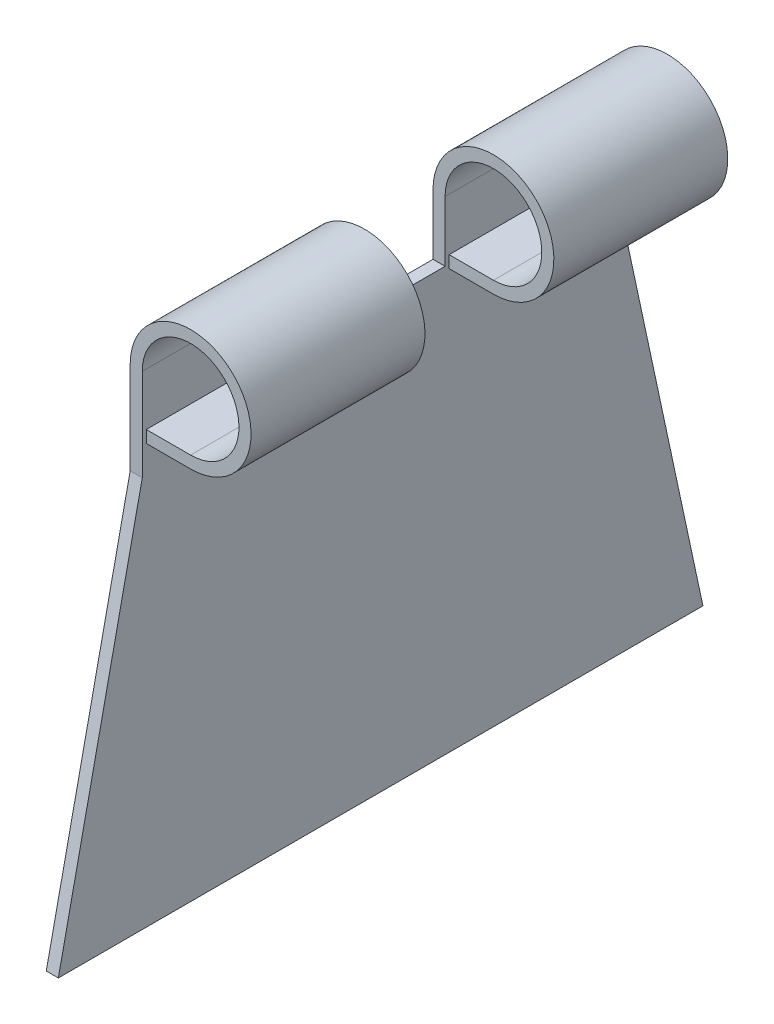
ISO-10303-21;
HEADER;
FILE_DESCRIPTION(('STEP AP214'),'2;1');
FILE_NAME('part.step','',(''),(''),'','','');
FILE_SCHEMA(('AUTOMOTIVE_DESIGN { 1 0 10303 214 1 1 1 1 }'));
ENDSEC;
DATA;
#1=APPLICATION_CONTEXT('core data for automotive mechanical design processes');
#2=APPLICATION_PROTOCOL_DEFINITION('international standard','automotive_design',2000,#1);
#3=PRODUCT_CONTEXT('',#1,'mechanical');
#4=PRODUCT('Part','Part','',(#3));
#5=PRODUCT_RELATED_PRODUCT_CATEGORY('part','',(#4));
#6=PRODUCT_DEFINITION_FORMATION('','',#4);
#7=PRODUCT_DEFINITION_CONTEXT('part definition',#1,'design');
#8=PRODUCT_DEFINITION('design','',#6,#7);
#9=PRODUCT_DEFINITION_SHAPE('','',#8);
#10=(LENGTH_UNIT() NAMED_UNIT(*) SI_UNIT(.MILLI.,.METRE.));
#11=(NAMED_UNIT(*) PLANE_ANGLE_UNIT() SI_UNIT($,.RADIAN.));
#12=(NAMED_UNIT(*) SI_UNIT($,.STERADIAN.) SOLID_ANGLE_UNIT());
#13=UNCERTAINTY_MEASURE_WITH_UNIT(LENGTH_MEASURE(1.E-05),#10,'distance_accuracy_value','');
#14=(GEOMETRIC_REPRESENTATION_CONTEXT(3) GLOBAL_UNCERTAINTY_ASSIGNED_CONTEXT((#13)) GLOBAL_UNIT_ASSIGNED_CONTEXT((#10,
#11,#12)) REPRESENTATION_CONTEXT('',''));
#15=CARTESIAN_POINT('',(0.,0.,0.));
#16=DIRECTION('',(0.,0.,1.));
#17=DIRECTION('',(1.,0.,0.));
#18=AXIS2_PLACEMENT_3D('',#15,#16,#17);
#19=CARTESIAN_POINT('',(0.,0.,80.));
#20=DIRECTION('',(0.,0.,-1.));
#21=DIRECTION('',(-1.,0.,0.));
#22=AXIS2_PLACEMENT_3D('',#19,#20,#21);
#23=CYLINDRICAL_SURFACE('',#22,7.5);
#24=CARTESIAN_POINT('',(0.,0.,10.4148336680274));
#25=DIRECTION('',(0.,0.,1.));
#26=DIRECTION('',(1.,0.,0.));
#27=AXIS2_PLACEMENT_3D('',#24,#25,#26);
#28=CIRCLE('',#27,7.5);
#29=CARTESIAN_POINT('',(0.,-7.5,10.4148336680274));
#30=VERTEX_POINT('',#29);
#31=CARTESIAN_POINT('',(-7.5,0.,10.4148336680274));
#32=VERTEX_POINT('',#31);
#33=EDGE_CURVE('E225',#30,#32,#28,.T.);
#34=ORIENTED_EDGE('',*,*,#33,.T.);
#35=DIRECTION('',(0.,0.,-1.));
#36=VECTOR('',#35,1.);
#37=CARTESIAN_POINT('',(-7.5,0.,80.));
#38=LINE('',#37,#36);
#39=CARTESIAN_POINT('',(-7.5,0.,32.));
#40=VERTEX_POINT('',#39);
#41=EDGE_CURVE('E288',#40,#32,#38,.T.);
#42=ORIENTED_EDGE('',*,*,#41,.F.);
#43=CARTESIAN_POINT('',(0.,0.,32.));
#44=DIRECTION('',(0.,0.,1.));
#45=DIRECTION('',(1.,0.,0.));
#46=AXIS2_PLACEMENT_3D('',#43,#44,#45);
#47=CIRCLE('',#46,7.5);
#48=CARTESIAN_POINT('',(0.,-7.5,32.));
#49=VERTEX_POINT('',#48);
#50=EDGE_CURVE('E261',#49,#40,#47,.T.);
#51=ORIENTED_EDGE('',*,*,#50,.F.);
#52=DIRECTION('',(0.,0.,-1.));
#53=VECTOR('',#52,1.);
#54=CARTESIAN_POINT('',(0.,-7.5,80.));
#55=LINE('',#54,#53);
#56=EDGE_CURVE('E268',#49,#30,#55,.T.);
#57=ORIENTED_EDGE('',*,*,#56,.T.);
#58=EDGE_LOOP('',(#34,#42,#51,#57));
#59=FACE_BOUND('',#58,.T.);
#60=ADVANCED_FACE('F43',(#59),#23,.T.);
#61=CARTESIAN_POINT('',(-7.5,0.,69.5851663319726));
#62=VERTEX_POINT('',#61);
#63=CARTESIAN_POINT('',(-7.5,0.,48.));
#64=VERTEX_POINT('',#63);
#65=EDGE_CURVE('E289',#62,#64,#38,.T.);
#66=ORIENTED_EDGE('',*,*,#65,.F.);
#67=CARTESIAN_POINT('',(0.,0.,69.5851663319726));
#68=DIRECTION('',(0.,0.,-1.));
#69=DIRECTION('',(-1.,0.,0.));
#70=AXIS2_PLACEMENT_3D('',#67,#68,#69);
#71=CIRCLE('',#70,7.5);
#72=CARTESIAN_POINT('',(0.,-7.5,69.5851663319726));
#73=VERTEX_POINT('',#72);
#74=EDGE_CURVE('E179',#62,#73,#71,.T.);
#75=ORIENTED_EDGE('',*,*,#74,.T.);
#76=CARTESIAN_POINT('',(0.,-7.5,48.));
#77=VERTEX_POINT('',#76);
#78=EDGE_CURVE('E57',#73,#77,#55,.T.);
#79=ORIENTED_EDGE('',*,*,#78,.T.);
#80=CARTESIAN_POINT('',(0.,0.,48.));
#81=DIRECTION('',(0.,0.,-1.));
#82=DIRECTION('',(-1.,0.,0.));
#83=AXIS2_PLACEMENT_3D('',#80,#81,#82);
#84=CIRCLE('',#83,7.5);
#85=EDGE_CURVE('E251',#64,#77,#84,.T.);
#86=ORIENTED_EDGE('',*,*,#85,.F.);
#87=EDGE_LOOP('',(#66,#75,#79,#86));
#88=FACE_BOUND('',#87,.T.);
#89=ADVANCED_FACE('F355',(#88),#23,.T.);
#90=CARTESIAN_POINT('',(-7.5,0.,80.));
#91=DIRECTION('',(1.,0.,0.));
#92=DIRECTION('',(0.,1.,0.));
#93=AXIS2_PLACEMENT_3D('',#90,#91,#92);
#94=PLANE('',#93);
#95=DIRECTION('',(0.,0.,-1.));
#96=VECTOR('',#95,1.);
#97=CARTESIAN_POINT('',(-7.49999999999999,-60.,80.));
#98=LINE('',#97,#96);
#99=CARTESIAN_POINT('',(-7.49999999999999,-60.,80.));
#100=VERTEX_POINT('',#99);
#101=CARTESIAN_POINT('',(-7.49999999999999,-60.,0.));
#102=VERTEX_POINT('',#101);
#103=EDGE_CURVE('E187',#100,#102,#98,.T.);
#104=ORIENTED_EDGE('',*,*,#103,.F.);
#105=DIRECTION('',(0.,-0.977763914611379,0.209708672409683));
#106=VECTOR('',#105,1.);
#107=CARTESIAN_POINT('',(-7.49999999999999,-60.,80.));
#108=LINE('',#107,#106);
#109=CARTESIAN_POINT('',(-7.5,-11.4409756150522,69.5851663319726));
#110=VERTEX_POINT('',#109);
#111=EDGE_CURVE('E66',#110,#100,#108,.T.);
#112=ORIENTED_EDGE('',*,*,#111,.F.);
#113=DIRECTION('',(0.,-1.,0.));
#114=VECTOR('',#113,1.);
#115=CARTESIAN_POINT('',(-7.5,-11.4409756150522,69.5851663319726));
#116=LINE('',#115,#114);
#117=EDGE_CURVE('E176',#62,#110,#116,.T.);
#118=ORIENTED_EDGE('',*,*,#117,.F.);
#119=ORIENTED_EDGE('',*,*,#65,.T.);
#120=DIRECTION('',(0.,-1.,0.));
#121=VECTOR('',#120,1.);
#122=CARTESIAN_POINT('',(-7.5,7.5,48.));
#123=LINE('',#122,#121);
#124=CARTESIAN_POINT('',(-7.5,-7.5,48.));
#125=VERTEX_POINT('',#124);
#126=EDGE_CURVE('E235',#64,#125,#123,.T.);
#127=ORIENTED_EDGE('',*,*,#126,.T.);
#128=DIRECTION('',(0.,0.,1.));
#129=VECTOR('',#128,1.);
#130=CARTESIAN_POINT('',(-7.5,-7.5,32.));
#131=LINE('',#130,#129);
#132=CARTESIAN_POINT('',(-7.5,-7.5,32.));
#133=VERTEX_POINT('',#132);
#134=EDGE_CURVE('E230',#133,#125,#131,.T.);
#135=ORIENTED_EDGE('',*,*,#134,.F.);
#136=DIRECTION('',(0.,-1.,0.));
#137=VECTOR('',#136,1.);
#138=CARTESIAN_POINT('',(-7.5,7.5,32.));
#139=LINE('',#138,#137);
#140=EDGE_CURVE('E238',#40,#133,#139,.T.);
#141=ORIENTED_EDGE('',*,*,#140,.F.);
#142=ORIENTED_EDGE('',*,*,#41,.T.);
#143=DIRECTION('',(0.,1.,0.));
#144=VECTOR('',#143,1.);
#145=CARTESIAN_POINT('',(-7.5,-11.4409756150522,10.4148336680274));
#146=LINE('',#145,#144);
#147=CARTESIAN_POINT('',(-7.5,-11.4409756150522,10.4148336680274));
#148=VERTEX_POINT('',#147);
#149=EDGE_CURVE('E194',#148,#32,#146,.T.);
#150=ORIENTED_EDGE('',*,*,#149,.F.);
#151=DIRECTION('',(0.,0.977763914611379,0.209708672409683));
#152=VECTOR('',#151,1.);
#153=CARTESIAN_POINT('',(-7.49999999999999,-60.,0.));
#154=LINE('',#153,#152);
#155=EDGE_CURVE('E191',#102,#148,#154,.T.);
#156=ORIENTED_EDGE('',*,*,#155,.F.);
#157=EDGE_LOOP('',(#104,#112,#118,#119,#127,#135,#141,#142,#150,#156));
#158=FACE_BOUND('',#157,.T.);
#159=ADVANCED_FACE('F184',(#158),#94,.F.);
#160=CARTESIAN_POINT('',(-6.,0.,80.));
#161=DIRECTION('',(-1.,0.,0.));
#162=DIRECTION('',(0.,-1.,0.));
#163=AXIS2_PLACEMENT_3D('',#160,#161,#162);
#164=PLANE('',#163);
#165=DIRECTION('',(0.,-1.,0.));
#166=VECTOR('',#165,1.);
#167=CARTESIAN_POINT('',(-6.,0.,69.5851663319726));
#168=LINE('',#167,#166);
#169=CARTESIAN_POINT('',(-6.,0.,69.5851663319726));
#170=VERTEX_POINT('',#169);
#171=CARTESIAN_POINT('',(-6.,-11.4409756150522,69.5851663319726));
#172=VERTEX_POINT('',#171);
#173=EDGE_CURVE('E210',#170,#172,#168,.T.);
#174=ORIENTED_EDGE('',*,*,#173,.T.);
#175=DIRECTION('',(0.,-0.977763914611379,0.209708672409683));
#176=VECTOR('',#175,1.);
#177=CARTESIAN_POINT('',(-6.,-2.63866363702991,67.6972656522052));
#178=LINE('',#177,#176);
#179=CARTESIAN_POINT('',(-5.99999999999999,-60.,80.));
#180=VERTEX_POINT('',#179);
#181=EDGE_CURVE('E170',#172,#180,#178,.T.);
#182=ORIENTED_EDGE('',*,*,#181,.T.);
#183=DIRECTION('',(0.,0.,-1.));
#184=VECTOR('',#183,1.);
#185=CARTESIAN_POINT('',(-5.99999999999999,-60.,80.));
#186=LINE('',#185,#184);
#187=CARTESIAN_POINT('',(-5.99999999999999,-60.,0.));
#188=VERTEX_POINT('',#187);
#189=EDGE_CURVE('E284',#180,#188,#186,.T.);
#190=ORIENTED_EDGE('',*,*,#189,.T.);
#191=DIRECTION('',(0.,0.977763914611379,0.209708672409683));
#192=VECTOR('',#191,1.);
#193=CARTESIAN_POINT('',(-6.,13.7649821600299,15.8209525305014));
#194=LINE('',#193,#192);
#195=CARTESIAN_POINT('',(-6.,-11.4409756150522,10.4148336680274));
#196=VERTEX_POINT('',#195);
#197=EDGE_CURVE('E173',#188,#196,#194,.T.);
#198=ORIENTED_EDGE('',*,*,#197,.T.);
#199=DIRECTION('',(0.,1.,0.));
#200=VECTOR('',#199,1.);
#201=CARTESIAN_POINT('',(-6.,0.,10.4148336680274));
#202=LINE('',#201,#200);
#203=CARTESIAN_POINT('',(-6.,0.,10.4148336680274));
#204=VERTEX_POINT('',#203);
#205=EDGE_CURVE('E222',#196,#204,#202,.T.);
#206=ORIENTED_EDGE('',*,*,#205,.T.);
#207=DIRECTION('',(0.,0.,-1.));
#208=VECTOR('',#207,1.);
#209=CARTESIAN_POINT('',(-6.,0.,80.));
#210=LINE('',#209,#208);
#211=CARTESIAN_POINT('',(-6.,0.,32.));
#212=VERTEX_POINT('',#211);
#213=EDGE_CURVE('E281',#212,#204,#210,.T.);
#214=ORIENTED_EDGE('',*,*,#213,.F.);
#215=DIRECTION('',(0.,1.,0.));
#216=VECTOR('',#215,1.);
#217=CARTESIAN_POINT('',(-6.,0.,32.));
#218=LINE('',#217,#216);
#219=CARTESIAN_POINT('',(-6.,-7.5,32.));
#220=VERTEX_POINT('',#219);
#221=EDGE_CURVE('E259',#220,#212,#218,.T.);
#222=ORIENTED_EDGE('',*,*,#221,.F.);
#223=DIRECTION('',(0.,0.,-1.));
#224=VECTOR('',#223,1.);
#225=CARTESIAN_POINT('',(-6.,-7.5,80.));
#226=LINE('',#225,#224);
#227=CARTESIAN_POINT('',(-6.,-7.5,48.));
#228=VERTEX_POINT('',#227);
#229=EDGE_CURVE('E263',#228,#220,#226,.T.);
#230=ORIENTED_EDGE('',*,*,#229,.F.);
#231=DIRECTION('',(0.,-1.,0.));
#232=VECTOR('',#231,1.);
#233=CARTESIAN_POINT('',(-6.,0.,48.));
#234=LINE('',#233,#232);
#235=CARTESIAN_POINT('',(-6.,0.,48.));
#236=VERTEX_POINT('',#235);
#237=EDGE_CURVE('E249',#236,#228,#234,.T.);
#238=ORIENTED_EDGE('',*,*,#237,.F.);
#239=EDGE_CURVE('E282',#170,#236,#210,.T.);
#240=ORIENTED_EDGE('',*,*,#239,.F.);
#241=EDGE_LOOP('',(#174,#182,#190,#198,#206,#214,#222,#230,#238,#240));
#242=FACE_BOUND('',#241,.T.);
#243=ADVANCED_FACE('F319',(#242),#164,.F.);
#244=CARTESIAN_POINT('',(0.,0.,80.));
#245=DIRECTION('',(0.,0.,-1.));
#246=DIRECTION('',(-1.,0.,0.));
#247=AXIS2_PLACEMENT_3D('',#244,#245,#246);
#248=CYLINDRICAL_SURFACE('',#247,6.);
#249=ORIENTED_EDGE('',*,*,#213,.T.);
#250=CARTESIAN_POINT('',(0.,0.,10.4148336680274));
#251=DIRECTION('',(0.,0.,1.));
#252=DIRECTION('',(1.,0.,0.));
#253=AXIS2_PLACEMENT_3D('',#250,#251,#252);
#254=CIRCLE('',#253,6.);
#255=CARTESIAN_POINT('',(0.,-6.,10.4148336680274));
#256=VERTEX_POINT('',#255);
#257=EDGE_CURVE('E219',#204,#256,#254,.F.);
#258=ORIENTED_EDGE('',*,*,#257,.T.);
#259=DIRECTION('',(0.,0.,-1.));
#260=VECTOR('',#259,1.);
#261=CARTESIAN_POINT('',(0.,-6.,80.));
#262=LINE('',#261,#260);
#263=CARTESIAN_POINT('',(0.,-6.,32.));
#264=VERTEX_POINT('',#263);
#265=EDGE_CURVE('E278',#264,#256,#262,.T.);
#266=ORIENTED_EDGE('',*,*,#265,.F.);
#267=CARTESIAN_POINT('',(0.,0.,32.));
#268=DIRECTION('',(0.,0.,1.));
#269=DIRECTION('',(1.,0.,0.));
#270=AXIS2_PLACEMENT_3D('',#267,#268,#269);
#271=CIRCLE('',#270,6.);
#272=EDGE_CURVE('E257',#212,#264,#271,.F.);
#273=ORIENTED_EDGE('',*,*,#272,.F.);
#274=EDGE_LOOP('',(#249,#258,#266,#273));
#275=FACE_BOUND('',#274,.T.);
#276=ADVANCED_FACE('F366',(#275),#248,.F.);
#277=CARTESIAN_POINT('',(0.,-6.,69.5851663319726));
#278=VERTEX_POINT('',#277);
#279=CARTESIAN_POINT('',(0.,-6.,48.));
#280=VERTEX_POINT('',#279);
#281=EDGE_CURVE('E279',#278,#280,#262,.T.);
#282=ORIENTED_EDGE('',*,*,#281,.F.);
#283=CARTESIAN_POINT('',(0.,0.,69.5851663319726));
#284=DIRECTION('',(0.,0.,-1.));
#285=DIRECTION('',(-1.,0.,0.));
#286=AXIS2_PLACEMENT_3D('',#283,#284,#285);
#287=CIRCLE('',#286,6.);
#288=EDGE_CURVE('E207',#278,#170,#287,.F.);
#289=ORIENTED_EDGE('',*,*,#288,.T.);
#290=ORIENTED_EDGE('',*,*,#239,.T.);
#291=CARTESIAN_POINT('',(0.,0.,48.));
#292=DIRECTION('',(0.,0.,-1.));
#293=DIRECTION('',(-1.,0.,0.));
#294=AXIS2_PLACEMENT_3D('',#291,#292,#293);
#295=CIRCLE('',#294,6.);
#296=EDGE_CURVE('E246',#280,#236,#295,.F.);
#297=ORIENTED_EDGE('',*,*,#296,.F.);
#298=EDGE_LOOP('',(#282,#289,#290,#297));
#299=FACE_BOUND('',#298,.T.);
#300=ADVANCED_FACE('F313',(#299),#248,.F.);
#301=CARTESIAN_POINT('',(0.,-6.,80.));
#302=DIRECTION('',(0.,-1.,0.));
#303=DIRECTION('',(1.,0.,0.));
#304=AXIS2_PLACEMENT_3D('',#301,#302,#303);
#305=PLANE('',#304);
#306=ORIENTED_EDGE('',*,*,#265,.T.);
#307=DIRECTION('',(-1.,0.,0.));
#308=VECTOR('',#307,1.);
#309=CARTESIAN_POINT('',(0.,-6.,10.4148336680274));
#310=LINE('',#309,#308);
#311=CARTESIAN_POINT('',(-5.5,-6.,10.4148336680274));
#312=VERTEX_POINT('',#311);
#313=EDGE_CURVE('E216',#256,#312,#310,.T.);
#314=ORIENTED_EDGE('',*,*,#313,.T.);
#315=DIRECTION('',(0.,0.,-1.));
#316=VECTOR('',#315,1.);
#317=CARTESIAN_POINT('',(-5.5,-6.,80.));
#318=LINE('',#317,#316);
#319=CARTESIAN_POINT('',(-5.5,-6.,32.));
#320=VERTEX_POINT('',#319);
#321=EDGE_CURVE('E275',#320,#312,#318,.T.);
#322=ORIENTED_EDGE('',*,*,#321,.F.);
#323=DIRECTION('',(-1.,0.,0.));
#324=VECTOR('',#323,1.);
#325=CARTESIAN_POINT('',(0.,-6.,32.));
#326=LINE('',#325,#324);
#327=EDGE_CURVE('E255',#264,#320,#326,.T.);
#328=ORIENTED_EDGE('',*,*,#327,.F.);
#329=EDGE_LOOP('',(#306,#314,#322,#328));
#330=FACE_BOUND('',#329,.T.);
#331=ADVANCED_FACE('F374',(#330),#305,.F.);
#332=CARTESIAN_POINT('',(-5.5,-6.,69.5851663319726));
#333=VERTEX_POINT('',#332);
#334=CARTESIAN_POINT('',(-5.5,-6.,48.));
#335=VERTEX_POINT('',#334);
#336=EDGE_CURVE('E276',#333,#335,#318,.T.);
#337=ORIENTED_EDGE('',*,*,#336,.F.);
#338=DIRECTION('',(1.,0.,0.));
#339=VECTOR('',#338,1.);
#340=CARTESIAN_POINT('',(0.,-6.,69.5851663319726));
#341=LINE('',#340,#339);
#342=EDGE_CURVE('E204',#333,#278,#341,.T.);
#343=ORIENTED_EDGE('',*,*,#342,.T.);
#344=ORIENTED_EDGE('',*,*,#281,.T.);
#345=DIRECTION('',(1.,0.,0.));
#346=VECTOR('',#345,1.);
#347=CARTESIAN_POINT('',(0.,-6.,48.));
#348=LINE('',#347,#346);
#349=EDGE_CURVE('E243',#335,#280,#348,.T.);
#350=ORIENTED_EDGE('',*,*,#349,.F.);
#351=EDGE_LOOP('',(#337,#343,#344,#350));
#352=FACE_BOUND('',#351,.T.);
#353=ADVANCED_FACE('F310',(#352),#305,.F.);
#354=CARTESIAN_POINT('',(-5.5,-6.,80.));
#355=DIRECTION('',(1.,0.,0.));
#356=DIRECTION('',(0.,0.,-1.));
#357=AXIS2_PLACEMENT_3D('',#354,#355,#356);
#358=PLANE('',#357);
#359=ORIENTED_EDGE('',*,*,#321,.T.);
#360=DIRECTION('',(0.,-1.,0.));
#361=VECTOR('',#360,1.);
#362=CARTESIAN_POINT('',(-5.5,-6.,10.4148336680274));
#363=LINE('',#362,#361);
#364=CARTESIAN_POINT('',(-5.5,-7.5,10.4148336680274));
#365=VERTEX_POINT('',#364);
#366=EDGE_CURVE('E213',#312,#365,#363,.T.);
#367=ORIENTED_EDGE('',*,*,#366,.T.);
#368=DIRECTION('',(0.,0.,-1.));
#369=VECTOR('',#368,1.);
#370=CARTESIAN_POINT('',(-5.5,-7.5,80.));
#371=LINE('',#370,#369);
#372=CARTESIAN_POINT('',(-5.5,-7.5,32.));
#373=VERTEX_POINT('',#372);
#374=EDGE_CURVE('E272',#373,#365,#371,.T.);
#375=ORIENTED_EDGE('',*,*,#374,.F.);
#376=DIRECTION('',(0.,-1.,0.));
#377=VECTOR('',#376,1.);
#378=CARTESIAN_POINT('',(-5.5,-6.,32.));
#379=LINE('',#378,#377);
#380=EDGE_CURVE('E253',#320,#373,#379,.T.);
#381=ORIENTED_EDGE('',*,*,#380,.F.);
#382=EDGE_LOOP('',(#359,#367,#375,#381));
#383=FACE_BOUND('',#382,.T.);
#384=ADVANCED_FACE('F378',(#383),#358,.F.);
#385=CARTESIAN_POINT('',(-5.5,-7.5,69.5851663319726));
#386=VERTEX_POINT('',#385);
#387=CARTESIAN_POINT('',(-5.5,-7.5,48.));
#388=VERTEX_POINT('',#387);
#389=EDGE_CURVE('E273',#386,#388,#371,.T.);
#390=ORIENTED_EDGE('',*,*,#389,.F.);
#391=DIRECTION('',(0.,1.,0.));
#392=VECTOR('',#391,1.);
#393=CARTESIAN_POINT('',(-5.5,-6.,69.5851663319726));
#394=LINE('',#393,#392);
#395=EDGE_CURVE('E201',#386,#333,#394,.T.);
#396=ORIENTED_EDGE('',*,*,#395,.T.);
#397=ORIENTED_EDGE('',*,*,#336,.T.);
#398=DIRECTION('',(0.,1.,0.));
#399=VECTOR('',#398,1.);
#400=CARTESIAN_POINT('',(-5.5,-6.,48.));
#401=LINE('',#400,#399);
#402=EDGE_CURVE('E240',#388,#335,#401,.T.);
#403=ORIENTED_EDGE('',*,*,#402,.F.);
#404=EDGE_LOOP('',(#390,#396,#397,#403));
#405=FACE_BOUND('',#404,.T.);
#406=ADVANCED_FACE('F303',(#405),#358,.F.);
#407=CARTESIAN_POINT('',(-5.5,-7.5,80.));
#408=DIRECTION('',(0.,1.,0.));
#409=DIRECTION('',(0.,0.,1.));
#410=AXIS2_PLACEMENT_3D('',#407,#408,#409);
#411=PLANE('',#410);
#412=ORIENTED_EDGE('',*,*,#374,.T.);
#413=DIRECTION('',(1.,0.,0.));
#414=VECTOR('',#413,1.);
#415=CARTESIAN_POINT('',(-5.5,-7.5,10.4148336680274));
#416=LINE('',#415,#414);
#417=EDGE_CURVE('E11',#365,#30,#416,.T.);
#418=ORIENTED_EDGE('',*,*,#417,.T.);
#419=ORIENTED_EDGE('',*,*,#56,.F.);
#420=DIRECTION('',(1.,0.,0.));
#421=VECTOR('',#420,1.);
#422=CARTESIAN_POINT('',(-5.5,-7.5,32.));
#423=LINE('',#422,#421);
#424=EDGE_CURVE('E294',#373,#49,#423,.T.);
#425=ORIENTED_EDGE('',*,*,#424,.F.);
#426=EDGE_LOOP('',(#412,#418,#419,#425));
#427=FACE_BOUND('',#426,.T.);
#428=ADVANCED_FACE('F382',(#427),#411,.F.);
#429=ORIENTED_EDGE('',*,*,#78,.F.);
#430=DIRECTION('',(-1.,0.,0.));
#431=VECTOR('',#430,1.);
#432=CARTESIAN_POINT('',(-5.5,-7.5,69.5851663319726));
#433=LINE('',#432,#431);
#434=EDGE_CURVE('E50',#73,#386,#433,.T.);
#435=ORIENTED_EDGE('',*,*,#434,.T.);
#436=ORIENTED_EDGE('',*,*,#389,.T.);
#437=DIRECTION('',(-1.,0.,0.));
#438=VECTOR('',#437,1.);
#439=CARTESIAN_POINT('',(-5.5,-7.5,48.));
#440=LINE('',#439,#438);
#441=EDGE_CURVE('E291',#77,#388,#440,.T.);
#442=ORIENTED_EDGE('',*,*,#441,.F.);
#443=EDGE_LOOP('',(#429,#435,#436,#442));
#444=FACE_BOUND('',#443,.T.);
#445=ADVANCED_FACE('F299',(#444),#411,.F.);
#446=CARTESIAN_POINT('',(-7.49999999999999,-60.,80.));
#447=DIRECTION('',(0.,1.,0.));
#448=DIRECTION('',(0.,0.,1.));
#449=AXIS2_PLACEMENT_3D('',#446,#447,#448);
#450=PLANE('',#449);
#451=DIRECTION('',(1.,0.,0.));
#452=VECTOR('',#451,1.);
#453=CARTESIAN_POINT('',(-7.49999999999999,-60.,0.));
#454=LINE('',#453,#452);
#455=EDGE_CURVE('E265',#102,#188,#454,.T.);
#456=ORIENTED_EDGE('',*,*,#455,.T.);
#457=ORIENTED_EDGE('',*,*,#189,.F.);
#458=DIRECTION('',(1.,0.,0.));
#459=VECTOR('',#458,1.);
#460=CARTESIAN_POINT('',(-7.49999999999999,-60.,80.));
#461=LINE('',#460,#459);
#462=EDGE_CURVE('E266',#100,#180,#461,.T.);
#463=ORIENTED_EDGE('',*,*,#462,.F.);
#464=ORIENTED_EDGE('',*,*,#103,.T.);
#465=EDGE_LOOP('',(#456,#457,#463,#464));
#466=FACE_BOUND('',#465,.T.);
#467=ADVANCED_FACE('F341',(#466),#450,.F.);
#468=CARTESIAN_POINT('',(0.,-7.5,0.));
#469=DIRECTION('',(0.,1.,0.));
#470=DIRECTION('',(0.,0.,1.));
#471=AXIS2_PLACEMENT_3D('',#468,#469,#470);
#472=PLANE('',#471);
#473=ORIENTED_EDGE('',*,*,#229,.T.);
#474=DIRECTION('',(-1.,0.,0.));
#475=VECTOR('',#474,1.);
#476=CARTESIAN_POINT('',(7.5,-7.5,32.));
#477=LINE('',#476,#475);
#478=EDGE_CURVE('E227',#220,#133,#477,.T.);
#479=ORIENTED_EDGE('',*,*,#478,.T.);
#480=ORIENTED_EDGE('',*,*,#134,.T.);
#481=DIRECTION('',(1.,0.,0.));
#482=VECTOR('',#481,1.);
#483=CARTESIAN_POINT('',(-7.5,-7.5,48.));
#484=LINE('',#483,#482);
#485=EDGE_CURVE('E232',#125,#228,#484,.T.);
#486=ORIENTED_EDGE('',*,*,#485,.T.);
#487=EDGE_LOOP('',(#473,#479,#480,#486));
#488=FACE_BOUND('',#487,.T.);
#489=ADVANCED_FACE('F324',(#488),#472,.T.);
#490=CARTESIAN_POINT('',(7.5,7.5,32.));
#491=DIRECTION('',(0.,0.,1.));
#492=DIRECTION('',(1.,0.,0.));
#493=AXIS2_PLACEMENT_3D('',#490,#491,#492);
#494=PLANE('',#493);
#495=ORIENTED_EDGE('',*,*,#50,.T.);
#496=ORIENTED_EDGE('',*,*,#140,.T.);
#497=ORIENTED_EDGE('',*,*,#478,.F.);
#498=ORIENTED_EDGE('',*,*,#221,.T.);
#499=ORIENTED_EDGE('',*,*,#272,.T.);
#500=ORIENTED_EDGE('',*,*,#327,.T.);
#501=ORIENTED_EDGE('',*,*,#380,.T.);
#502=ORIENTED_EDGE('',*,*,#424,.T.);
#503=EDGE_LOOP('',(#495,#496,#497,#498,#499,#500,#501,#502));
#504=FACE_BOUND('',#503,.T.);
#505=ADVANCED_FACE('F327',(#504),#494,.T.);
#506=CARTESIAN_POINT('',(-7.5,7.5,48.));
#507=DIRECTION('',(0.,0.,-1.));
#508=DIRECTION('',(-1.,0.,0.));
#509=AXIS2_PLACEMENT_3D('',#506,#507,#508);
#510=PLANE('',#509);
#511=ORIENTED_EDGE('',*,*,#85,.T.);
#512=ORIENTED_EDGE('',*,*,#441,.T.);
#513=ORIENTED_EDGE('',*,*,#402,.T.);
#514=ORIENTED_EDGE('',*,*,#349,.T.);
#515=ORIENTED_EDGE('',*,*,#296,.T.);
#516=ORIENTED_EDGE('',*,*,#237,.T.);
#517=ORIENTED_EDGE('',*,*,#485,.F.);
#518=ORIENTED_EDGE('',*,*,#126,.F.);
#519=EDGE_LOOP('',(#511,#512,#513,#514,#515,#516,#517,#518));
#520=FACE_BOUND('',#519,.T.);
#521=ADVANCED_FACE('F307',(#520),#510,.T.);
#522=CARTESIAN_POINT('',(7.5,-11.4409756150522,10.4148336680274));
#523=DIRECTION('',(0.,0.,1.));
#524=DIRECTION('',(1.,0.,0.));
#525=AXIS2_PLACEMENT_3D('',#522,#523,#524);
#526=PLANE('',#525);
#527=ORIENTED_EDGE('',*,*,#33,.F.);
#528=ORIENTED_EDGE('',*,*,#417,.F.);
#529=ORIENTED_EDGE('',*,*,#366,.F.);
#530=ORIENTED_EDGE('',*,*,#313,.F.);
#531=ORIENTED_EDGE('',*,*,#257,.F.);
#532=ORIENTED_EDGE('',*,*,#205,.F.);
#533=DIRECTION('',(-1.,0.,0.));
#534=VECTOR('',#533,1.);
#535=CARTESIAN_POINT('',(7.5,-11.4409756150522,10.4148336680274));
#536=LINE('',#535,#534);
#537=EDGE_CURVE('E182',#196,#148,#536,.T.);
#538=ORIENTED_EDGE('',*,*,#537,.T.);
#539=ORIENTED_EDGE('',*,*,#149,.T.);
#540=EDGE_LOOP('',(#527,#528,#529,#530,#531,#532,#538,#539));
#541=FACE_BOUND('',#540,.T.);
#542=ADVANCED_FACE('F337',(#541),#526,.F.);
#543=CARTESIAN_POINT('',(7.50000000000001,-60.,0.));
#544=DIRECTION('',(0.,-0.209708672409683,0.977763914611379));
#545=DIRECTION('',(0.,-0.977763914611379,-0.209708672409683));
#546=AXIS2_PLACEMENT_3D('',#543,#544,#545);
#547=PLANE('',#546);
#548=ORIENTED_EDGE('',*,*,#455,.F.);
#549=ORIENTED_EDGE('',*,*,#155,.T.);
#550=ORIENTED_EDGE('',*,*,#537,.F.);
#551=ORIENTED_EDGE('',*,*,#197,.F.);
#552=EDGE_LOOP('',(#548,#549,#550,#551));
#553=FACE_BOUND('',#552,.T.);
#554=ADVANCED_FACE('F344',(#553),#547,.F.);
#555=CARTESIAN_POINT('',(7.5,-11.4409756150522,69.5851663319726));
#556=DIRECTION('',(0.,0.,-1.));
#557=DIRECTION('',(-1.,0.,0.));
#558=AXIS2_PLACEMENT_3D('',#555,#556,#557);
#559=PLANE('',#558);
#560=ORIENTED_EDGE('',*,*,#117,.T.);
#561=DIRECTION('',(-1.,0.,0.));
#562=VECTOR('',#561,1.);
#563=CARTESIAN_POINT('',(7.5,-11.4409756150522,69.5851663319726));
#564=LINE('',#563,#562);
#565=EDGE_CURVE('E166',#172,#110,#564,.T.);
#566=ORIENTED_EDGE('',*,*,#565,.F.);
#567=ORIENTED_EDGE('',*,*,#173,.F.);
#568=ORIENTED_EDGE('',*,*,#288,.F.);
#569=ORIENTED_EDGE('',*,*,#342,.F.);
#570=ORIENTED_EDGE('',*,*,#395,.F.);
#571=ORIENTED_EDGE('',*,*,#434,.F.);
#572=ORIENTED_EDGE('',*,*,#74,.F.);
#573=EDGE_LOOP('',(#560,#566,#567,#568,#569,#570,#571,#572));
#574=FACE_BOUND('',#573,.T.);
#575=ADVANCED_FACE('F177',(#574),#559,.F.);
#576=CARTESIAN_POINT('',(7.50000000000001,-60.,80.));
#577=DIRECTION('',(0.,-0.209708672409683,-0.977763914611379));
#578=DIRECTION('',(0.,0.977763914611379,-0.209708672409683));
#579=AXIS2_PLACEMENT_3D('',#576,#577,#578);
#580=PLANE('',#579);
#581=ORIENTED_EDGE('',*,*,#565,.T.);
#582=ORIENTED_EDGE('',*,*,#111,.T.);
#583=ORIENTED_EDGE('',*,*,#462,.T.);
#584=ORIENTED_EDGE('',*,*,#181,.F.);
#585=EDGE_LOOP('',(#581,#582,#583,#584));
#586=FACE_BOUND('',#585,.T.);
#587=ADVANCED_FACE('F168',(#586),#580,.F.);
#588=CLOSED_SHELL('',(#60,#89,#159,#243,#276,#300,#331,#353,#384,#406,#428,#445,#467,#489,#505,
#521,#542,#554,#575,#587));
#589=MANIFOLD_SOLID_BREP('B2',#588);
#590=ADVANCED_BREP_SHAPE_REPRESENTATION('',(#18,#589),#14);
#591=SHAPE_DEFINITION_REPRESENTATION(#9,#590);
ENDSEC;
END-ISO-10303-21;
